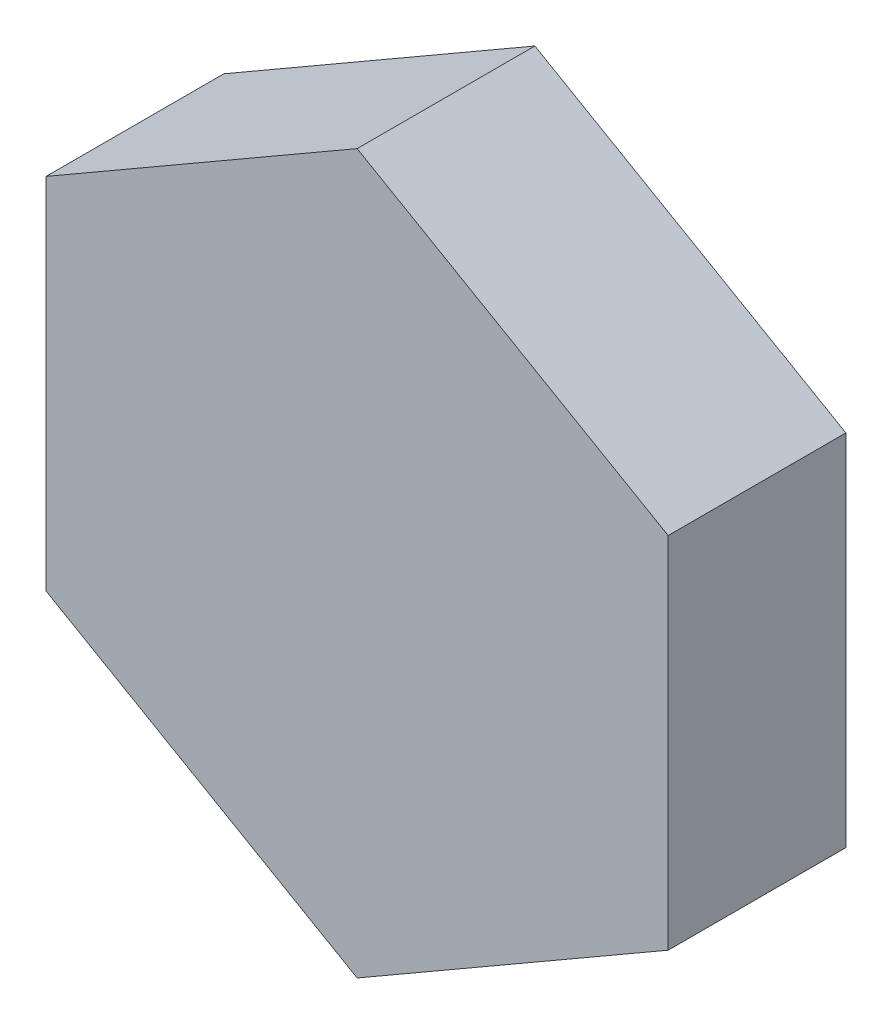
ISO-10303-21;
HEADER;
FILE_DESCRIPTION(('STEP AP214'),'2;1');
FILE_NAME('part.step','',(''),(''),'','','');
FILE_SCHEMA(('AUTOMOTIVE_DESIGN { 1 0 10303 214 1 1 1 1 }'));
ENDSEC;
DATA;
#1=APPLICATION_CONTEXT('core data for automotive mechanical design processes');
#2=APPLICATION_PROTOCOL_DEFINITION('international standard','automotive_design',2000,#1);
#3=PRODUCT_CONTEXT('',#1,'mechanical');
#4=PRODUCT('Part','Part','',(#3));
#5=PRODUCT_RELATED_PRODUCT_CATEGORY('part','',(#4));
#6=PRODUCT_DEFINITION_FORMATION('','',#4);
#7=PRODUCT_DEFINITION_CONTEXT('part definition',#1,'design');
#8=PRODUCT_DEFINITION('design','',#6,#7);
#9=PRODUCT_DEFINITION_SHAPE('','',#8);
#10=(LENGTH_UNIT() NAMED_UNIT(*) SI_UNIT(.MILLI.,.METRE.));
#11=(NAMED_UNIT(*) PLANE_ANGLE_UNIT() SI_UNIT($,.RADIAN.));
#12=(NAMED_UNIT(*) SI_UNIT($,.STERADIAN.) SOLID_ANGLE_UNIT());
#13=UNCERTAINTY_MEASURE_WITH_UNIT(LENGTH_MEASURE(1.E-05),#10,'distance_accuracy_value','');
#14=(GEOMETRIC_REPRESENTATION_CONTEXT(3) GLOBAL_UNCERTAINTY_ASSIGNED_CONTEXT((#13)) GLOBAL_UNIT_ASSIGNED_CONTEXT((#10,
#11,#12)) REPRESENTATION_CONTEXT('',''));
#15=CARTESIAN_POINT('',(0.,0.,0.));
#16=DIRECTION('',(0.,0.,1.));
#17=DIRECTION('',(1.,0.,0.));
#18=AXIS2_PLACEMENT_3D('',#15,#16,#17);
#19=CARTESIAN_POINT('',(0.,-4.04145188432738,2.));
#20=DIRECTION('',(-0.5,0.866025403784439,0.));
#21=DIRECTION('',(-0.866025403784439,-0.5,0.));
#22=AXIS2_PLACEMENT_3D('',#19,#20,#21);
#23=PLANE('',#22);
#24=DIRECTION('',(0.866025403784438,0.5,0.));
#25=VECTOR('',#24,1.);
#26=CARTESIAN_POINT('',(0.,-4.04145188432738,0.));
#27=LINE('',#26,#25);
#28=CARTESIAN_POINT('',(0.,-4.04145188432738,0.));
#29=VERTEX_POINT('',#28);
#30=CARTESIAN_POINT('',(3.5,-2.02072594216369,0.));
#31=VERTEX_POINT('',#30);
#32=EDGE_CURVE('E117',#29,#31,#27,.T.);
#33=ORIENTED_EDGE('',*,*,#32,.T.);
#34=DIRECTION('',(0.,0.,-1.));
#35=VECTOR('',#34,1.);
#36=CARTESIAN_POINT('',(3.5,-2.02072594216369,2.));
#37=LINE('',#36,#35);
#38=CARTESIAN_POINT('',(3.5,-2.02072594216369,2.));
#39=VERTEX_POINT('',#38);
#40=EDGE_CURVE('E11',#39,#31,#37,.T.);
#41=ORIENTED_EDGE('',*,*,#40,.F.);
#42=DIRECTION('',(0.866025403784438,0.5,0.));
#43=VECTOR('',#42,1.);
#44=CARTESIAN_POINT('',(0.,-4.04145188432738,2.));
#45=LINE('',#44,#43);
#46=CARTESIAN_POINT('',(0.,-4.04145188432738,2.));
#47=VERTEX_POINT('',#46);
#48=EDGE_CURVE('E127',#47,#39,#45,.T.);
#49=ORIENTED_EDGE('',*,*,#48,.F.);
#50=DIRECTION('',(0.,0.,-1.));
#51=VECTOR('',#50,1.);
#52=CARTESIAN_POINT('',(0.,-4.04145188432738,2.));
#53=LINE('',#52,#51);
#54=EDGE_CURVE('E113',#47,#29,#53,.T.);
#55=ORIENTED_EDGE('',*,*,#54,.T.);
#56=EDGE_LOOP('',(#33,#41,#49,#55));
#57=FACE_BOUND('',#56,.T.);
#58=ADVANCED_FACE('F33',(#57),#23,.F.);
#59=CARTESIAN_POINT('',(3.5,-2.02072594216369,2.));
#60=DIRECTION('',(-1.,0.,0.));
#61=DIRECTION('',(0.,-1.,0.));
#62=AXIS2_PLACEMENT_3D('',#59,#60,#61);
#63=PLANE('',#62);
#64=DIRECTION('',(0.,1.,0.));
#65=VECTOR('',#64,1.);
#66=CARTESIAN_POINT('',(3.5,-2.02072594216369,0.));
#67=LINE('',#66,#65);
#68=CARTESIAN_POINT('',(3.5,2.02072594216369,0.));
#69=VERTEX_POINT('',#68);
#70=EDGE_CURVE('E120',#31,#69,#67,.T.);
#71=ORIENTED_EDGE('',*,*,#70,.T.);
#72=DIRECTION('',(0.,0.,-1.));
#73=VECTOR('',#72,1.);
#74=CARTESIAN_POINT('',(3.5,2.02072594216369,2.));
#75=LINE('',#74,#73);
#76=CARTESIAN_POINT('',(3.5,2.02072594216369,2.));
#77=VERTEX_POINT('',#76);
#78=EDGE_CURVE('E41',#77,#69,#75,.T.);
#79=ORIENTED_EDGE('',*,*,#78,.F.);
#80=DIRECTION('',(0.,1.,0.));
#81=VECTOR('',#80,1.);
#82=CARTESIAN_POINT('',(3.5,-2.02072594216369,2.));
#83=LINE('',#82,#81);
#84=EDGE_CURVE('E86',#39,#77,#83,.T.);
#85=ORIENTED_EDGE('',*,*,#84,.F.);
#86=ORIENTED_EDGE('',*,*,#40,.T.);
#87=EDGE_LOOP('',(#71,#79,#85,#86));
#88=FACE_BOUND('',#87,.T.);
#89=ADVANCED_FACE('F151',(#88),#63,.F.);
#90=CARTESIAN_POINT('',(3.5,2.02072594216369,2.));
#91=DIRECTION('',(-0.5,-0.866025403784439,0.));
#92=DIRECTION('',(0.866025403784439,-0.5,0.));
#93=AXIS2_PLACEMENT_3D('',#90,#91,#92);
#94=PLANE('',#93);
#95=DIRECTION('',(-0.866025403784439,0.5,0.));
#96=VECTOR('',#95,1.);
#97=CARTESIAN_POINT('',(3.5,2.02072594216369,0.));
#98=LINE('',#97,#96);
#99=CARTESIAN_POINT('',(0.,4.04145188432738,0.));
#100=VERTEX_POINT('',#99);
#101=EDGE_CURVE('E122',#69,#100,#98,.T.);
#102=ORIENTED_EDGE('',*,*,#101,.T.);
#103=DIRECTION('',(0.,0.,-1.));
#104=VECTOR('',#103,1.);
#105=CARTESIAN_POINT('',(0.,4.04145188432738,2.));
#106=LINE('',#105,#104);
#107=CARTESIAN_POINT('',(0.,4.04145188432738,2.));
#108=VERTEX_POINT('',#107);
#109=EDGE_CURVE('E108',#108,#100,#106,.T.);
#110=ORIENTED_EDGE('',*,*,#109,.F.);
#111=DIRECTION('',(-0.866025403784439,0.5,0.));
#112=VECTOR('',#111,1.);
#113=CARTESIAN_POINT('',(3.5,2.02072594216369,2.));
#114=LINE('',#113,#112);
#115=EDGE_CURVE('E99',#77,#108,#114,.T.);
#116=ORIENTED_EDGE('',*,*,#115,.F.);
#117=ORIENTED_EDGE('',*,*,#78,.T.);
#118=EDGE_LOOP('',(#102,#110,#116,#117));
#119=FACE_BOUND('',#118,.T.);
#120=ADVANCED_FACE('F133',(#119),#94,.F.);
#121=CARTESIAN_POINT('',(0.,4.04145188432738,2.));
#122=DIRECTION('',(0.5,-0.866025403784439,0.));
#123=DIRECTION('',(0.866025403784439,0.5,0.));
#124=AXIS2_PLACEMENT_3D('',#121,#122,#123);
#125=PLANE('',#124);
#126=DIRECTION('',(-0.866025403784439,-0.5,0.));
#127=VECTOR('',#126,1.);
#128=CARTESIAN_POINT('',(0.,4.04145188432738,0.));
#129=LINE('',#128,#127);
#130=CARTESIAN_POINT('',(-3.5,2.02072594216369,0.));
#131=VERTEX_POINT('',#130);
#132=EDGE_CURVE('E107',#100,#131,#129,.T.);
#133=ORIENTED_EDGE('',*,*,#132,.T.);
#134=DIRECTION('',(0.,0.,-1.));
#135=VECTOR('',#134,1.);
#136=CARTESIAN_POINT('',(-3.5,2.02072594216369,2.));
#137=LINE('',#136,#135);
#138=CARTESIAN_POINT('',(-3.5,2.02072594216369,2.));
#139=VERTEX_POINT('',#138);
#140=EDGE_CURVE('E104',#139,#131,#137,.T.);
#141=ORIENTED_EDGE('',*,*,#140,.F.);
#142=DIRECTION('',(-0.866025403784439,-0.5,0.));
#143=VECTOR('',#142,1.);
#144=CARTESIAN_POINT('',(0.,4.04145188432738,2.));
#145=LINE('',#144,#143);
#146=EDGE_CURVE('E93',#108,#139,#145,.T.);
#147=ORIENTED_EDGE('',*,*,#146,.F.);
#148=ORIENTED_EDGE('',*,*,#109,.T.);
#149=EDGE_LOOP('',(#133,#141,#147,#148));
#150=FACE_BOUND('',#149,.T.);
#151=ADVANCED_FACE('F105',(#150),#125,.F.);
#152=CARTESIAN_POINT('',(-3.5,2.02072594216369,2.));
#153=DIRECTION('',(1.,0.,0.));
#154=DIRECTION('',(0.,1.,0.));
#155=AXIS2_PLACEMENT_3D('',#152,#153,#154);
#156=PLANE('',#155);
#157=DIRECTION('',(0.,-1.,0.));
#158=VECTOR('',#157,1.);
#159=CARTESIAN_POINT('',(-3.5,2.02072594216369,0.));
#160=LINE('',#159,#158);
#161=CARTESIAN_POINT('',(-3.5,-2.02072594216369,0.));
#162=VERTEX_POINT('',#161);
#163=EDGE_CURVE('E72',#131,#162,#160,.T.);
#164=ORIENTED_EDGE('',*,*,#163,.T.);
#165=DIRECTION('',(0.,0.,-1.));
#166=VECTOR('',#165,1.);
#167=CARTESIAN_POINT('',(-3.5,-2.02072594216369,2.));
#168=LINE('',#167,#166);
#169=CARTESIAN_POINT('',(-3.5,-2.02072594216369,2.));
#170=VERTEX_POINT('',#169);
#171=EDGE_CURVE('E109',#170,#162,#168,.T.);
#172=ORIENTED_EDGE('',*,*,#171,.F.);
#173=DIRECTION('',(0.,-1.,0.));
#174=VECTOR('',#173,1.);
#175=CARTESIAN_POINT('',(-3.5,2.02072594216369,2.));
#176=LINE('',#175,#174);
#177=EDGE_CURVE('E97',#139,#170,#176,.T.);
#178=ORIENTED_EDGE('',*,*,#177,.F.);
#179=ORIENTED_EDGE('',*,*,#140,.T.);
#180=EDGE_LOOP('',(#164,#172,#178,#179));
#181=FACE_BOUND('',#180,.T.);
#182=ADVANCED_FACE('F111',(#181),#156,.F.);
#183=CARTESIAN_POINT('',(-3.5,-2.02072594216369,2.));
#184=DIRECTION('',(0.5,0.866025403784439,0.));
#185=DIRECTION('',(-0.866025403784439,0.5,0.));
#186=AXIS2_PLACEMENT_3D('',#183,#184,#185);
#187=PLANE('',#186);
#188=DIRECTION('',(0.866025403784439,-0.5,0.));
#189=VECTOR('',#188,1.);
#190=CARTESIAN_POINT('',(-3.5,-2.02072594216369,0.));
#191=LINE('',#190,#189);
#192=EDGE_CURVE('E78',#162,#29,#191,.T.);
#193=ORIENTED_EDGE('',*,*,#192,.T.);
#194=ORIENTED_EDGE('',*,*,#54,.F.);
#195=DIRECTION('',(0.866025403784439,-0.5,0.));
#196=VECTOR('',#195,1.);
#197=CARTESIAN_POINT('',(-3.5,-2.02072594216369,2.));
#198=LINE('',#197,#196);
#199=EDGE_CURVE('E49',#170,#47,#198,.T.);
#200=ORIENTED_EDGE('',*,*,#199,.F.);
#201=ORIENTED_EDGE('',*,*,#171,.T.);
#202=EDGE_LOOP('',(#193,#194,#200,#201));
#203=FACE_BOUND('',#202,.T.);
#204=ADVANCED_FACE('F140',(#203),#187,.F.);
#205=CARTESIAN_POINT('',(0.,0.,2.));
#206=DIRECTION('',(0.,0.,1.));
#207=DIRECTION('',(1.,0.,0.));
#208=AXIS2_PLACEMENT_3D('',#205,#206,#207);
#209=PLANE('',#208);
#210=ORIENTED_EDGE('',*,*,#48,.T.);
#211=ORIENTED_EDGE('',*,*,#84,.T.);
#212=ORIENTED_EDGE('',*,*,#115,.T.);
#213=ORIENTED_EDGE('',*,*,#146,.T.);
#214=ORIENTED_EDGE('',*,*,#177,.T.);
#215=ORIENTED_EDGE('',*,*,#199,.T.);
#216=EDGE_LOOP('',(#210,#211,#212,#213,#214,#215));
#217=FACE_BOUND('',#216,.T.);
#218=ADVANCED_FACE('F95',(#217),#209,.T.);
#219=CARTESIAN_POINT('',(0.,0.,0.));
#220=DIRECTION('',(0.,0.,1.));
#221=DIRECTION('',(1.,0.,0.));
#222=AXIS2_PLACEMENT_3D('',#219,#220,#221);
#223=PLANE('',#222);
#224=ORIENTED_EDGE('',*,*,#32,.F.);
#225=ORIENTED_EDGE('',*,*,#192,.F.);
#226=ORIENTED_EDGE('',*,*,#163,.F.);
#227=ORIENTED_EDGE('',*,*,#132,.F.);
#228=ORIENTED_EDGE('',*,*,#101,.F.);
#229=ORIENTED_EDGE('',*,*,#70,.F.);
#230=EDGE_LOOP('',(#224,#225,#226,#227,#228,#229));
#231=FACE_BOUND('',#230,.T.);
#232=ADVANCED_FACE('F136',(#231),#223,.F.);
#233=CLOSED_SHELL('',(#58,#89,#120,#151,#182,#204,#218,#232));
#234=MANIFOLD_SOLID_BREP('B2',#233);
#235=ADVANCED_BREP_SHAPE_REPRESENTATION('',(#18,#234),#14);
#236=SHAPE_DEFINITION_REPRESENTATION(#9,#235);
ENDSEC;
END-ISO-10303-21;
